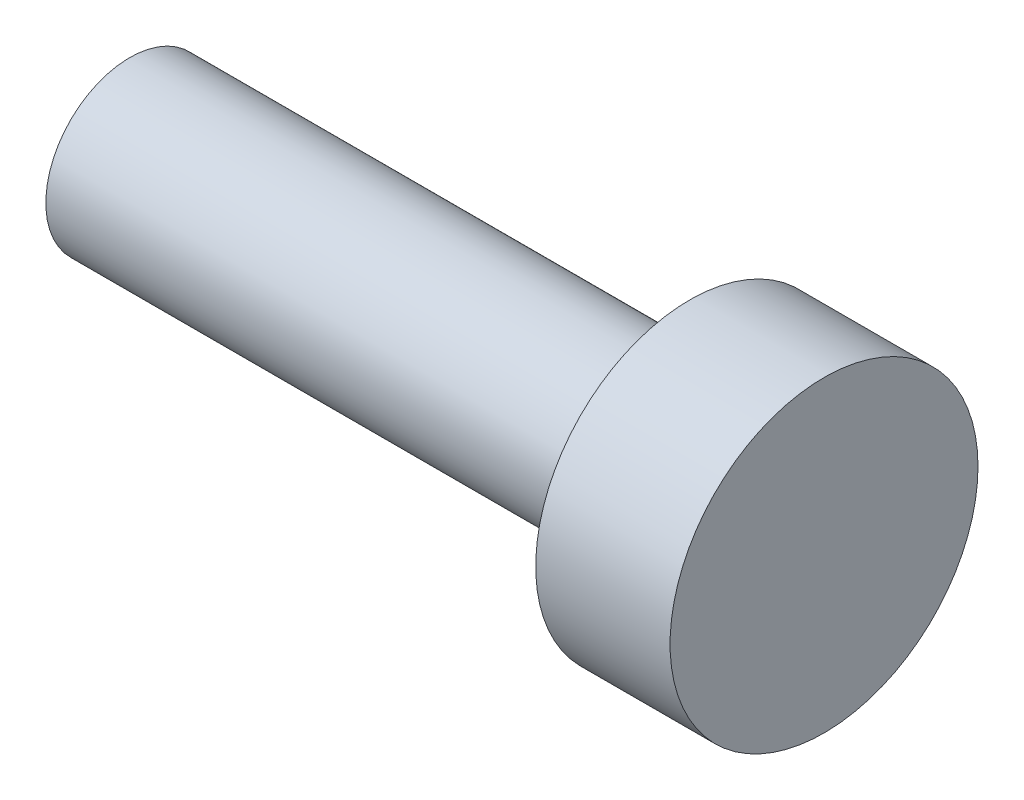
ISO-10303-21;
HEADER;
FILE_DESCRIPTION(('STEP AP214'),'2;1');
FILE_NAME('part.step','',(''),(''),'','','');
FILE_SCHEMA(('AUTOMOTIVE_DESIGN { 1 0 10303 214 1 1 1 1 }'));
ENDSEC;
DATA;
#1=APPLICATION_CONTEXT('core data for automotive mechanical design processes');
#2=APPLICATION_PROTOCOL_DEFINITION('international standard','automotive_design',2000,#1);
#3=PRODUCT_CONTEXT('',#1,'mechanical');
#4=PRODUCT('Part','Part','',(#3));
#5=PRODUCT_RELATED_PRODUCT_CATEGORY('part','',(#4));
#6=PRODUCT_DEFINITION_FORMATION('','',#4);
#7=PRODUCT_DEFINITION_CONTEXT('part definition',#1,'design');
#8=PRODUCT_DEFINITION('design','',#6,#7);
#9=PRODUCT_DEFINITION_SHAPE('','',#8);
#10=(LENGTH_UNIT() NAMED_UNIT(*) SI_UNIT(.MILLI.,.METRE.));
#11=(NAMED_UNIT(*) PLANE_ANGLE_UNIT() SI_UNIT($,.RADIAN.));
#12=(NAMED_UNIT(*) SI_UNIT($,.STERADIAN.) SOLID_ANGLE_UNIT());
#13=UNCERTAINTY_MEASURE_WITH_UNIT(LENGTH_MEASURE(1.E-05),#10,'distance_accuracy_value','');
#14=(GEOMETRIC_REPRESENTATION_CONTEXT(3) GLOBAL_UNCERTAINTY_ASSIGNED_CONTEXT((#13)) GLOBAL_UNIT_ASSIGNED_CONTEXT((#10,
#11,#12)) REPRESENTATION_CONTEXT('',''));
#15=CARTESIAN_POINT('',(0.,0.,0.));
#16=DIRECTION('',(0.,0.,1.));
#17=DIRECTION('',(1.,0.,0.));
#18=AXIS2_PLACEMENT_3D('',#15,#16,#17);
#19=CARTESIAN_POINT('',(54.708348754,-19.,-12.));
#20=DIRECTION('',(-1.,0.,0.));
#21=DIRECTION('',(0.,0.,1.));
#22=AXIS2_PLACEMENT_3D('',#19,#20,#21);
#23=CYLINDRICAL_SURFACE('',#22,1.5);
#24=CARTESIAN_POINT('',(54.708348754,-19.,-12.));
#25=DIRECTION('',(1.,0.,0.));
#26=DIRECTION('',(0.,0.,-1.));
#27=AXIS2_PLACEMENT_3D('',#24,#25,#26);
#28=CIRCLE('',#27,1.5);
#29=CARTESIAN_POINT('',(54.708348754,-19.,-13.5));
#30=VERTEX_POINT('',#29);
#31=EDGE_CURVE('E10',#30,#30,#28,.T.);
#32=ORIENTED_EDGE('',*,*,#31,.F.);
#33=EDGE_LOOP('',(#32));
#34=FACE_BOUND('',#33,.T.);
#35=CARTESIAN_POINT('',(44.708348754,-19.,-12.));
#36=DIRECTION('',(1.,0.,0.));
#37=DIRECTION('',(0.,0.,-1.));
#38=AXIS2_PLACEMENT_3D('',#35,#36,#37);
#39=CIRCLE('',#38,1.5);
#40=CARTESIAN_POINT('',(44.708348754,-19.,-13.5));
#41=VERTEX_POINT('',#40);
#42=EDGE_CURVE('E45',#41,#41,#39,.T.);
#43=ORIENTED_EDGE('',*,*,#42,.T.);
#44=EDGE_LOOP('',(#43));
#45=FACE_BOUND('',#44,.T.);
#46=ADVANCED_FACE('F39',(#34,#45),#23,.T.);
#47=CARTESIAN_POINT('',(44.708348754,-19.,-12.));
#48=DIRECTION('',(1.,0.,0.));
#49=DIRECTION('',(0.,0.,-1.));
#50=AXIS2_PLACEMENT_3D('',#47,#48,#49);
#51=PLANE('',#50);
#52=ORIENTED_EDGE('',*,*,#42,.F.);
#53=EDGE_LOOP('',(#52));
#54=FACE_BOUND('',#53,.T.);
#55=ADVANCED_FACE('F62',(#54),#51,.F.);
#56=CARTESIAN_POINT('',(57.108348754,-19.,-12.));
#57=DIRECTION('',(-1.,0.,0.));
#58=DIRECTION('',(0.,0.,1.));
#59=AXIS2_PLACEMENT_3D('',#56,#57,#58);
#60=CYLINDRICAL_SURFACE('',#59,2.75);
#61=CARTESIAN_POINT('',(57.108348754,-19.,-12.));
#62=DIRECTION('',(1.,0.,0.));
#63=DIRECTION('',(0.,0.,-1.));
#64=AXIS2_PLACEMENT_3D('',#61,#62,#63);
#65=CIRCLE('',#64,2.75);
#66=CARTESIAN_POINT('',(57.108348754,-19.,-14.75));
#67=VERTEX_POINT('',#66);
#68=EDGE_CURVE('E47',#67,#67,#65,.T.);
#69=ORIENTED_EDGE('',*,*,#68,.F.);
#70=EDGE_LOOP('',(#69));
#71=FACE_BOUND('',#70,.T.);
#72=CARTESIAN_POINT('',(54.708348754,-19.,-12.));
#73=DIRECTION('',(1.,0.,0.));
#74=DIRECTION('',(0.,0.,-1.));
#75=AXIS2_PLACEMENT_3D('',#72,#73,#74);
#76=CIRCLE('',#75,2.75);
#77=CARTESIAN_POINT('',(54.708348754,-19.,-14.75));
#78=VERTEX_POINT('',#77);
#79=EDGE_CURVE('E51',#78,#78,#76,.T.);
#80=ORIENTED_EDGE('',*,*,#79,.T.);
#81=EDGE_LOOP('',(#80));
#82=FACE_BOUND('',#81,.T.);
#83=ADVANCED_FACE('F56',(#71,#82),#60,.T.);
#84=CARTESIAN_POINT('',(57.108348754,-19.,-12.));
#85=DIRECTION('',(1.,0.,0.));
#86=DIRECTION('',(0.,0.,-1.));
#87=AXIS2_PLACEMENT_3D('',#84,#85,#86);
#88=PLANE('',#87);
#89=ORIENTED_EDGE('',*,*,#68,.T.);
#90=EDGE_LOOP('',(#89));
#91=FACE_BOUND('',#90,.T.);
#92=ADVANCED_FACE('F60',(#91),#88,.T.);
#93=CARTESIAN_POINT('',(54.708348754,-19.,-12.));
#94=DIRECTION('',(1.,0.,0.));
#95=DIRECTION('',(0.,0.,-1.));
#96=AXIS2_PLACEMENT_3D('',#93,#94,#95);
#97=PLANE('',#96);
#98=ORIENTED_EDGE('',*,*,#31,.T.);
#99=EDGE_LOOP('',(#98));
#100=FACE_BOUND('',#99,.T.);
#101=ORIENTED_EDGE('',*,*,#79,.F.);
#102=EDGE_LOOP('',(#101));
#103=FACE_BOUND('',#102,.T.);
#104=ADVANCED_FACE('F66',(#100,#103),#97,.F.);
#105=CLOSED_SHELL('',(#46,#55,#83,#92,#104));
#106=MANIFOLD_SOLID_BREP('B2',#105);
#107=ADVANCED_BREP_SHAPE_REPRESENTATION('',(#18,#106),#14);
#108=SHAPE_DEFINITION_REPRESENTATION(#9,#107);
ENDSEC;
END-ISO-10303-21;
